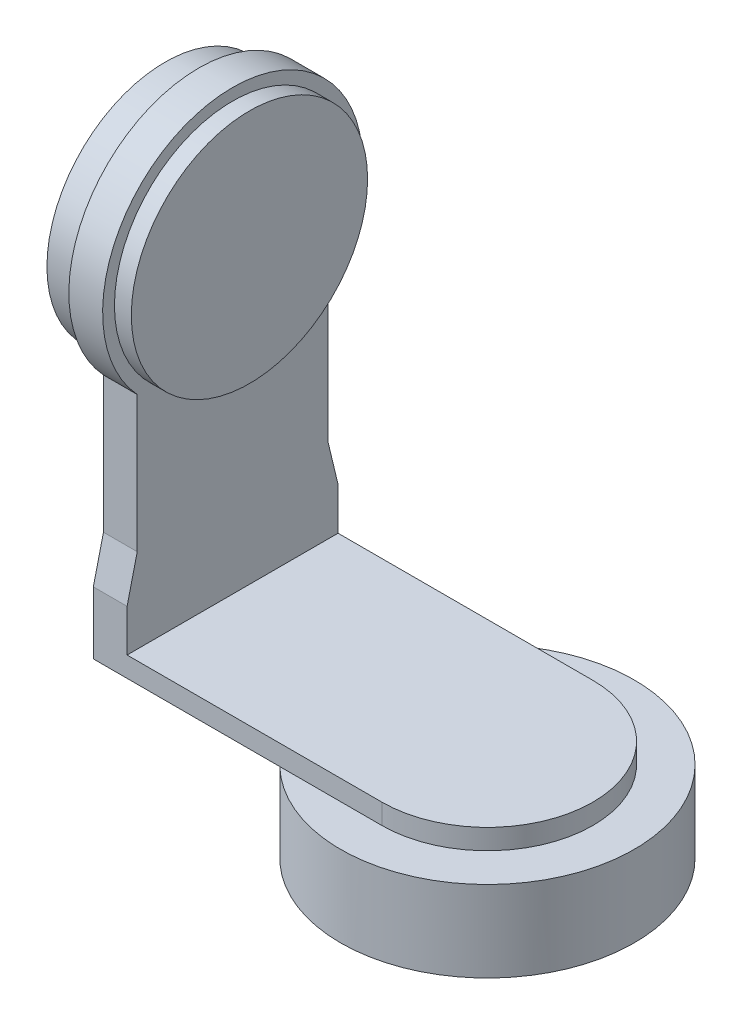
ISO-10303-21;
HEADER;
FILE_DESCRIPTION(('STEP AP214'),'2;1');
FILE_NAME('part.step','',(''),(''),'','','');
FILE_SCHEMA(('AUTOMOTIVE_DESIGN { 1 0 10303 214 1 1 1 1 }'));
ENDSEC;
DATA;
#1=APPLICATION_CONTEXT('core data for automotive mechanical design processes');
#2=APPLICATION_PROTOCOL_DEFINITION('international standard','automotive_design',2000,#1);
#3=PRODUCT_CONTEXT('',#1,'mechanical');
#4=PRODUCT('Part','Part','',(#3));
#5=PRODUCT_RELATED_PRODUCT_CATEGORY('part','',(#4));
#6=PRODUCT_DEFINITION_FORMATION('','',#4);
#7=PRODUCT_DEFINITION_CONTEXT('part definition',#1,'design');
#8=PRODUCT_DEFINITION('design','',#6,#7);
#9=PRODUCT_DEFINITION_SHAPE('','',#8);
#10=(LENGTH_UNIT() NAMED_UNIT(*) SI_UNIT(.MILLI.,.METRE.));
#11=(NAMED_UNIT(*) PLANE_ANGLE_UNIT() SI_UNIT($,.RADIAN.));
#12=(NAMED_UNIT(*) SI_UNIT($,.STERADIAN.) SOLID_ANGLE_UNIT());
#13=UNCERTAINTY_MEASURE_WITH_UNIT(LENGTH_MEASURE(1.E-05),#10,'distance_accuracy_value','');
#14=(GEOMETRIC_REPRESENTATION_CONTEXT(3) GLOBAL_UNCERTAINTY_ASSIGNED_CONTEXT((#13)) GLOBAL_UNIT_ASSIGNED_CONTEXT((#10,
#11,#12)) REPRESENTATION_CONTEXT('',''));
#15=CARTESIAN_POINT('',(0.,0.,0.));
#16=DIRECTION('',(0.,0.,1.));
#17=DIRECTION('',(1.,0.,0.));
#18=AXIS2_PLACEMENT_3D('',#15,#16,#17);
#19=CARTESIAN_POINT('',(0.,12.,0.));
#20=DIRECTION('',(0.,1.,0.));
#21=DIRECTION('',(0.,0.,1.));
#22=AXIS2_PLACEMENT_3D('',#19,#20,#21);
#23=PLANE('',#22);
#24=DIRECTION('',(-1.,0.,0.));
#25=VECTOR('',#24,1.);
#26=CARTESIAN_POINT('',(-34.2,12.,-12.5));
#27=LINE('',#26,#25);
#28=CARTESIAN_POINT('',(0.,12.,-12.5));
#29=VERTEX_POINT('',#28);
#30=CARTESIAN_POINT('',(-30.2,12.,-12.5));
#31=VERTEX_POINT('',#30);
#32=EDGE_CURVE('E185',#29,#31,#27,.T.);
#33=ORIENTED_EDGE('',*,*,#32,.T.);
#34=DIRECTION('',(0.,0.,1.));
#35=VECTOR('',#34,1.);
#36=CARTESIAN_POINT('',(-30.2,12.,12.5));
#37=LINE('',#36,#35);
#38=CARTESIAN_POINT('',(-30.2,12.,12.5));
#39=VERTEX_POINT('',#38);
#40=EDGE_CURVE('E156',#31,#39,#37,.T.);
#41=ORIENTED_EDGE('',*,*,#40,.T.);
#42=DIRECTION('',(1.,0.,0.));
#43=VECTOR('',#42,1.);
#44=CARTESIAN_POINT('',(0.,12.,12.5));
#45=LINE('',#44,#43);
#46=CARTESIAN_POINT('',(0.,12.,12.5));
#47=VERTEX_POINT('',#46);
#48=EDGE_CURVE('E189',#39,#47,#45,.T.);
#49=ORIENTED_EDGE('',*,*,#48,.T.);
#50=CARTESIAN_POINT('',(0.,12.,0.));
#51=DIRECTION('',(0.,1.,0.));
#52=DIRECTION('',(0.,0.,1.));
#53=AXIS2_PLACEMENT_3D('',#50,#51,#52);
#54=CIRCLE('',#53,12.5);
#55=EDGE_CURVE('E182',#47,#29,#54,.T.);
#56=ORIENTED_EDGE('',*,*,#55,.T.);
#57=EDGE_LOOP('',(#33,#41,#49,#56));
#58=FACE_BOUND('',#57,.T.);
#59=ADVANCED_FACE('F35',(#58),#23,.T.);
#60=CARTESIAN_POINT('',(0.,9.6,0.));
#61=DIRECTION('',(0.,-1.,0.));
#62=DIRECTION('',(0.,0.,-1.));
#63=AXIS2_PLACEMENT_3D('',#60,#61,#62);
#64=CYLINDRICAL_SURFACE('',#63,17.4);
#65=CARTESIAN_POINT('',(0.,9.6,0.));
#66=DIRECTION('',(0.,1.,0.));
#67=DIRECTION('',(0.,0.,1.));
#68=AXIS2_PLACEMENT_3D('',#65,#66,#67);
#69=CIRCLE('',#68,17.4);
#70=CARTESIAN_POINT('',(-12.1041315260534,9.6,-12.5));
#71=VERTEX_POINT('',#70);
#72=CARTESIAN_POINT('',(-12.1041315260534,9.6,12.5));
#73=VERTEX_POINT('',#72);
#74=EDGE_CURVE('E214',#71,#73,#69,.T.);
#75=ORIENTED_EDGE('',*,*,#74,.F.);
#76=EDGE_CURVE('E216',#73,#71,#69,.T.);
#77=ORIENTED_EDGE('',*,*,#76,.F.);
#78=EDGE_LOOP('',(#75,#77));
#79=FACE_BOUND('',#78,.T.);
#80=CARTESIAN_POINT('',(0.,0.,0.));
#81=DIRECTION('',(0.,1.,0.));
#82=DIRECTION('',(0.,0.,1.));
#83=AXIS2_PLACEMENT_3D('',#80,#81,#82);
#84=CIRCLE('',#83,17.4);
#85=CARTESIAN_POINT('',(0.,0.,17.4));
#86=VERTEX_POINT('',#85);
#87=EDGE_CURVE('E213',#86,#86,#84,.T.);
#88=ORIENTED_EDGE('',*,*,#87,.T.);
#89=EDGE_LOOP('',(#88));
#90=FACE_BOUND('',#89,.T.);
#91=ADVANCED_FACE('F37',(#79,#90),#64,.T.);
#92=CARTESIAN_POINT('',(0.,9.6,0.));
#93=DIRECTION('',(0.,1.,0.));
#94=DIRECTION('',(0.,0.,1.));
#95=AXIS2_PLACEMENT_3D('',#92,#93,#94);
#96=PLANE('',#95);
#97=DIRECTION('',(1.,0.,0.));
#98=VECTOR('',#97,1.);
#99=CARTESIAN_POINT('',(0.,9.6,12.5));
#100=LINE('',#99,#98);
#101=CARTESIAN_POINT('',(0.,9.6,12.5));
#102=VERTEX_POINT('',#101);
#103=EDGE_CURVE('E201',#73,#102,#100,.T.);
#104=ORIENTED_EDGE('',*,*,#103,.F.);
#105=ORIENTED_EDGE('',*,*,#76,.T.);
#106=DIRECTION('',(-1.,0.,0.));
#107=VECTOR('',#106,1.);
#108=CARTESIAN_POINT('',(-34.2,9.6,-12.5));
#109=LINE('',#108,#107);
#110=CARTESIAN_POINT('',(0.,9.6,-12.5));
#111=VERTEX_POINT('',#110);
#112=EDGE_CURVE('E194',#111,#71,#109,.T.);
#113=ORIENTED_EDGE('',*,*,#112,.F.);
#114=CARTESIAN_POINT('',(0.,9.6,0.));
#115=DIRECTION('',(0.,1.,0.));
#116=DIRECTION('',(0.,0.,1.));
#117=AXIS2_PLACEMENT_3D('',#114,#115,#116);
#118=CIRCLE('',#117,12.5);
#119=EDGE_CURVE('E58',#102,#111,#118,.T.);
#120=ORIENTED_EDGE('',*,*,#119,.F.);
#121=EDGE_LOOP('',(#104,#105,#113,#120));
#122=FACE_BOUND('',#121,.T.);
#123=ADVANCED_FACE('F223',(#122),#96,.T.);
#124=CARTESIAN_POINT('',(0.,0.,0.));
#125=DIRECTION('',(0.,1.,0.));
#126=DIRECTION('',(0.,0.,1.));
#127=AXIS2_PLACEMENT_3D('',#124,#125,#126);
#128=PLANE('',#127);
#129=ORIENTED_EDGE('',*,*,#87,.F.);
#130=EDGE_LOOP('',(#129));
#131=FACE_BOUND('',#130,.T.);
#132=ADVANCED_FACE('F268',(#131),#128,.F.);
#133=CARTESIAN_POINT('',(0.,9.6,0.));
#134=DIRECTION('',(0.,1.,0.));
#135=DIRECTION('',(0.,0.,1.));
#136=AXIS2_PLACEMENT_3D('',#133,#134,#135);
#137=PLANE('',#136);
#138=CARTESIAN_POINT('',(-34.2,9.6,-12.5));
#139=VERTEX_POINT('',#138);
#140=EDGE_CURVE('E193',#71,#139,#109,.T.);
#141=ORIENTED_EDGE('',*,*,#140,.F.);
#142=ORIENTED_EDGE('',*,*,#74,.T.);
#143=CARTESIAN_POINT('',(-34.2,9.6,12.5));
#144=VERTEX_POINT('',#143);
#145=EDGE_CURVE('E186',#144,#73,#100,.T.);
#146=ORIENTED_EDGE('',*,*,#145,.F.);
#147=DIRECTION('',(0.,0.,1.));
#148=VECTOR('',#147,1.);
#149=CARTESIAN_POINT('',(-34.2,9.6,12.5));
#150=LINE('',#149,#148);
#151=EDGE_CURVE('E197',#139,#144,#150,.T.);
#152=ORIENTED_EDGE('',*,*,#151,.F.);
#153=EDGE_LOOP('',(#141,#142,#146,#152));
#154=FACE_BOUND('',#153,.T.);
#155=ADVANCED_FACE('F227',(#154),#137,.F.);
#156=CARTESIAN_POINT('',(0.,12.,0.));
#157=DIRECTION('',(0.,-1.,0.));
#158=DIRECTION('',(0.,0.,-1.));
#159=AXIS2_PLACEMENT_3D('',#156,#157,#158);
#160=CYLINDRICAL_SURFACE('',#159,12.5);
#161=ORIENTED_EDGE('',*,*,#119,.T.);
#162=DIRECTION('',(0.,-1.,0.));
#163=VECTOR('',#162,1.);
#164=CARTESIAN_POINT('',(0.,12.,-12.5));
#165=LINE('',#164,#163);
#166=EDGE_CURVE('E210',#29,#111,#165,.T.);
#167=ORIENTED_EDGE('',*,*,#166,.F.);
#168=ORIENTED_EDGE('',*,*,#55,.F.);
#169=DIRECTION('',(0.,-1.,0.));
#170=VECTOR('',#169,1.);
#171=CARTESIAN_POINT('',(0.,12.,12.5));
#172=LINE('',#171,#170);
#173=EDGE_CURVE('E191',#47,#102,#172,.T.);
#174=ORIENTED_EDGE('',*,*,#173,.T.);
#175=EDGE_LOOP('',(#161,#167,#168,#174));
#176=FACE_BOUND('',#175,.T.);
#177=ADVANCED_FACE('F234',(#176),#160,.T.);
#178=CARTESIAN_POINT('',(-34.2,12.,-12.5));
#179=DIRECTION('',(0.,0.,1.));
#180=DIRECTION('',(1.,0.,0.));
#181=AXIS2_PLACEMENT_3D('',#178,#179,#180);
#182=PLANE('',#181);
#183=ORIENTED_EDGE('',*,*,#112,.T.);
#184=ORIENTED_EDGE('',*,*,#140,.T.);
#185=DIRECTION('',(0.,-1.,0.));
#186=VECTOR('',#185,1.);
#187=CARTESIAN_POINT('',(-34.2,12.,-12.5));
#188=LINE('',#187,#186);
#189=CARTESIAN_POINT('',(-34.2,17.,-12.5));
#190=VERTEX_POINT('',#189);
#191=EDGE_CURVE('E207',#190,#139,#188,.T.);
#192=ORIENTED_EDGE('',*,*,#191,.F.);
#193=DIRECTION('',(-1.,0.,0.));
#194=VECTOR('',#193,1.);
#195=CARTESIAN_POINT('',(-30.2,17.,-12.5));
#196=LINE('',#195,#194);
#197=CARTESIAN_POINT('',(-30.2,17.,-12.5));
#198=VERTEX_POINT('',#197);
#199=EDGE_CURVE('E178',#198,#190,#196,.T.);
#200=ORIENTED_EDGE('',*,*,#199,.F.);
#201=DIRECTION('',(0.,-1.,0.));
#202=VECTOR('',#201,1.);
#203=CARTESIAN_POINT('',(-30.2,12.,-12.5));
#204=LINE('',#203,#202);
#205=EDGE_CURVE('E153',#198,#31,#204,.T.);
#206=ORIENTED_EDGE('',*,*,#205,.T.);
#207=ORIENTED_EDGE('',*,*,#32,.F.);
#208=ORIENTED_EDGE('',*,*,#166,.T.);
#209=EDGE_LOOP('',(#183,#184,#192,#200,#206,#207,#208));
#210=FACE_BOUND('',#209,.T.);
#211=ADVANCED_FACE('F230',(#210),#182,.F.);
#212=CARTESIAN_POINT('',(-34.2,12.,12.5));
#213=DIRECTION('',(1.,0.,0.));
#214=DIRECTION('',(0.,0.,-1.));
#215=AXIS2_PLACEMENT_3D('',#212,#213,#214);
#216=PLANE('',#215);
#217=CARTESIAN_POINT('',(-34.2,48.6,0.));
#218=DIRECTION('',(-1.,0.,0.));
#219=DIRECTION('',(0.,0.,1.));
#220=AXIS2_PLACEMENT_3D('',#217,#218,#219);
#221=CIRCLE('',#220,14.);
#222=CARTESIAN_POINT('',(-34.2,48.6,14.));
#223=VERTEX_POINT('',#222);
#224=EDGE_CURVE('E43',#223,#223,#221,.T.);
#225=ORIENTED_EDGE('',*,*,#224,.F.);
#226=EDGE_LOOP('',(#225));
#227=FACE_BOUND('',#226,.T.);
#228=ORIENTED_EDGE('',*,*,#151,.T.);
#229=DIRECTION('',(0.,-1.,0.));
#230=VECTOR('',#229,1.);
#231=CARTESIAN_POINT('',(-34.2,12.,12.5));
#232=LINE('',#231,#230);
#233=CARTESIAN_POINT('',(-34.2,17.,12.5));
#234=VERTEX_POINT('',#233);
#235=EDGE_CURVE('E204',#234,#144,#232,.T.);
#236=ORIENTED_EDGE('',*,*,#235,.F.);
#237=DIRECTION('',(0.,0.972387301980517,-0.233372952475324));
#238=VECTOR('',#237,1.);
#239=CARTESIAN_POINT('',(-34.2,17.,12.5));
#240=LINE('',#239,#238);
#241=CARTESIAN_POINT('',(-34.2,22.,11.3));
#242=VERTEX_POINT('',#241);
#243=EDGE_CURVE('E147',#234,#242,#240,.T.);
#244=ORIENTED_EDGE('',*,*,#243,.T.);
#245=DIRECTION('',(0.,1.,0.));
#246=VECTOR('',#245,1.);
#247=CARTESIAN_POINT('',(-34.2,22.,11.3));
#248=LINE('',#247,#246);
#249=CARTESIAN_POINT('',(-34.2,38.1372087854149,11.3));
#250=VERTEX_POINT('',#249);
#251=EDGE_CURVE('E144',#242,#250,#248,.T.);
#252=ORIENTED_EDGE('',*,*,#251,.T.);
#253=CARTESIAN_POINT('',(-34.2,48.6,0.));
#254=DIRECTION('',(-1.,0.,0.));
#255=DIRECTION('',(0.,0.,1.));
#256=AXIS2_PLACEMENT_3D('',#253,#254,#255);
#257=CIRCLE('',#256,15.4);
#258=CARTESIAN_POINT('',(-34.2,38.1372087854149,-11.3));
#259=VERTEX_POINT('',#258);
#260=EDGE_CURVE('E163',#250,#259,#257,.T.);
#261=ORIENTED_EDGE('',*,*,#260,.T.);
#262=DIRECTION('',(0.,-1.,0.));
#263=VECTOR('',#262,1.);
#264=CARTESIAN_POINT('',(-34.2,22.,-11.3));
#265=LINE('',#264,#263);
#266=CARTESIAN_POINT('',(-34.2,22.,-11.3));
#267=VERTEX_POINT('',#266);
#268=EDGE_CURVE('E124',#259,#267,#265,.T.);
#269=ORIENTED_EDGE('',*,*,#268,.T.);
#270=DIRECTION('',(0.,-0.972387301980517,-0.233372952475324));
#271=VECTOR('',#270,1.);
#272=CARTESIAN_POINT('',(-34.2,17.,-12.5));
#273=LINE('',#272,#271);
#274=EDGE_CURVE('E167',#267,#190,#273,.T.);
#275=ORIENTED_EDGE('',*,*,#274,.T.);
#276=ORIENTED_EDGE('',*,*,#191,.T.);
#277=EDGE_LOOP('',(#228,#236,#244,#252,#261,#269,#275,#276));
#278=FACE_BOUND('',#277,.T.);
#279=ADVANCED_FACE('F244',(#227,#278),#216,.F.);
#280=CARTESIAN_POINT('',(0.,12.,12.5));
#281=DIRECTION('',(0.,0.,-1.));
#282=DIRECTION('',(-1.,0.,0.));
#283=AXIS2_PLACEMENT_3D('',#280,#281,#282);
#284=PLANE('',#283);
#285=ORIENTED_EDGE('',*,*,#145,.T.);
#286=ORIENTED_EDGE('',*,*,#103,.T.);
#287=ORIENTED_EDGE('',*,*,#173,.F.);
#288=ORIENTED_EDGE('',*,*,#48,.F.);
#289=DIRECTION('',(0.,1.,0.));
#290=VECTOR('',#289,1.);
#291=CARTESIAN_POINT('',(-30.2,12.,12.5));
#292=LINE('',#291,#290);
#293=CARTESIAN_POINT('',(-30.2,17.,12.5));
#294=VERTEX_POINT('',#293);
#295=EDGE_CURVE('E50',#39,#294,#292,.T.);
#296=ORIENTED_EDGE('',*,*,#295,.T.);
#297=DIRECTION('',(-1.,0.,0.));
#298=VECTOR('',#297,1.);
#299=CARTESIAN_POINT('',(-30.2,17.,12.5));
#300=LINE('',#299,#298);
#301=EDGE_CURVE('E175',#294,#234,#300,.T.);
#302=ORIENTED_EDGE('',*,*,#301,.T.);
#303=ORIENTED_EDGE('',*,*,#235,.T.);
#304=EDGE_LOOP('',(#285,#286,#287,#288,#296,#302,#303));
#305=FACE_BOUND('',#304,.T.);
#306=ADVANCED_FACE('F238',(#305),#284,.F.);
#307=CARTESIAN_POINT('',(-30.2,48.6,0.));
#308=DIRECTION('',(-1.,0.,0.));
#309=DIRECTION('',(0.,0.,1.));
#310=AXIS2_PLACEMENT_3D('',#307,#308,#309);
#311=CYLINDRICAL_SURFACE('',#310,15.4);
#312=ORIENTED_EDGE('',*,*,#260,.F.);
#313=DIRECTION('',(-1.,0.,0.));
#314=VECTOR('',#313,1.);
#315=CARTESIAN_POINT('',(-30.2,38.1372087854149,11.3));
#316=LINE('',#315,#314);
#317=CARTESIAN_POINT('',(-30.2,38.1372087854149,11.3));
#318=VERTEX_POINT('',#317);
#319=EDGE_CURVE('E143',#318,#250,#316,.T.);
#320=ORIENTED_EDGE('',*,*,#319,.F.);
#321=CARTESIAN_POINT('',(-30.2,48.6,0.));
#322=DIRECTION('',(-1.,0.,0.));
#323=DIRECTION('',(0.,0.,1.));
#324=AXIS2_PLACEMENT_3D('',#321,#322,#323);
#325=CIRCLE('',#324,15.4);
#326=CARTESIAN_POINT('',(-30.2,38.1372087854149,-11.3));
#327=VERTEX_POINT('',#326);
#328=EDGE_CURVE('E136',#318,#327,#325,.T.);
#329=ORIENTED_EDGE('',*,*,#328,.T.);
#330=DIRECTION('',(-1.,0.,0.));
#331=VECTOR('',#330,1.);
#332=CARTESIAN_POINT('',(-30.2,38.1372087854149,-11.3));
#333=LINE('',#332,#331);
#334=EDGE_CURVE('E119',#327,#259,#333,.T.);
#335=ORIENTED_EDGE('',*,*,#334,.T.);
#336=EDGE_LOOP('',(#312,#320,#329,#335));
#337=FACE_BOUND('',#336,.T.);
#338=ADVANCED_FACE('F142',(#337),#311,.T.);
#339=CARTESIAN_POINT('',(-30.2,22.,11.3));
#340=DIRECTION('',(0.,0.,1.));
#341=DIRECTION('',(1.,0.,0.));
#342=AXIS2_PLACEMENT_3D('',#339,#340,#341);
#343=PLANE('',#342);
#344=ORIENTED_EDGE('',*,*,#251,.F.);
#345=DIRECTION('',(-1.,0.,0.));
#346=VECTOR('',#345,1.);
#347=CARTESIAN_POINT('',(-30.2,22.,11.3));
#348=LINE('',#347,#346);
#349=CARTESIAN_POINT('',(-30.2,22.,11.3));
#350=VERTEX_POINT('',#349);
#351=EDGE_CURVE('E173',#350,#242,#348,.T.);
#352=ORIENTED_EDGE('',*,*,#351,.F.);
#353=DIRECTION('',(0.,1.,0.));
#354=VECTOR('',#353,1.);
#355=CARTESIAN_POINT('',(-30.2,22.,11.3));
#356=LINE('',#355,#354);
#357=EDGE_CURVE('E130',#350,#318,#356,.T.);
#358=ORIENTED_EDGE('',*,*,#357,.T.);
#359=ORIENTED_EDGE('',*,*,#319,.T.);
#360=EDGE_LOOP('',(#344,#352,#358,#359));
#361=FACE_BOUND('',#360,.T.);
#362=ADVANCED_FACE('F253',(#361),#343,.T.);
#363=CARTESIAN_POINT('',(-30.2,17.,12.5));
#364=DIRECTION('',(0.,0.233372952475324,0.972387301980517));
#365=DIRECTION('',(0.,-0.972387301980517,0.233372952475324));
#366=AXIS2_PLACEMENT_3D('',#363,#364,#365);
#367=PLANE('',#366);
#368=ORIENTED_EDGE('',*,*,#243,.F.);
#369=ORIENTED_EDGE('',*,*,#301,.F.);
#370=DIRECTION('',(0.,0.972387301980517,-0.233372952475324));
#371=VECTOR('',#370,1.);
#372=CARTESIAN_POINT('',(-30.2,17.,12.5));
#373=LINE('',#372,#371);
#374=EDGE_CURVE('E159',#294,#350,#373,.T.);
#375=ORIENTED_EDGE('',*,*,#374,.T.);
#376=ORIENTED_EDGE('',*,*,#351,.T.);
#377=EDGE_LOOP('',(#368,#369,#375,#376));
#378=FACE_BOUND('',#377,.T.);
#379=ADVANCED_FACE('F250',(#378),#367,.T.);
#380=CARTESIAN_POINT('',(-30.2,17.,-12.5));
#381=DIRECTION('',(0.,0.233372952475324,-0.972387301980517));
#382=DIRECTION('',(0.,0.972387301980517,0.233372952475324));
#383=AXIS2_PLACEMENT_3D('',#380,#381,#382);
#384=PLANE('',#383);
#385=ORIENTED_EDGE('',*,*,#274,.F.);
#386=DIRECTION('',(-1.,0.,0.));
#387=VECTOR('',#386,1.);
#388=CARTESIAN_POINT('',(-30.2,22.,-11.3));
#389=LINE('',#388,#387);
#390=CARTESIAN_POINT('',(-30.2,22.,-11.3));
#391=VERTEX_POINT('',#390);
#392=EDGE_CURVE('E129',#391,#267,#389,.T.);
#393=ORIENTED_EDGE('',*,*,#392,.F.);
#394=DIRECTION('',(0.,-0.972387301980517,-0.233372952475324));
#395=VECTOR('',#394,1.);
#396=CARTESIAN_POINT('',(-30.2,17.,-12.5));
#397=LINE('',#396,#395);
#398=EDGE_CURVE('E140',#391,#198,#397,.T.);
#399=ORIENTED_EDGE('',*,*,#398,.T.);
#400=ORIENTED_EDGE('',*,*,#199,.T.);
#401=EDGE_LOOP('',(#385,#393,#399,#400));
#402=FACE_BOUND('',#401,.T.);
#403=ADVANCED_FACE('F256',(#402),#384,.T.);
#404=CARTESIAN_POINT('',(-30.2,22.,-11.3));
#405=DIRECTION('',(0.,0.,-1.));
#406=DIRECTION('',(-1.,0.,0.));
#407=AXIS2_PLACEMENT_3D('',#404,#405,#406);
#408=PLANE('',#407);
#409=ORIENTED_EDGE('',*,*,#268,.F.);
#410=ORIENTED_EDGE('',*,*,#334,.F.);
#411=DIRECTION('',(0.,-1.,0.));
#412=VECTOR('',#411,1.);
#413=CARTESIAN_POINT('',(-30.2,22.,-11.3));
#414=LINE('',#413,#412);
#415=EDGE_CURVE('E122',#327,#391,#414,.T.);
#416=ORIENTED_EDGE('',*,*,#415,.T.);
#417=ORIENTED_EDGE('',*,*,#392,.T.);
#418=EDGE_LOOP('',(#409,#410,#416,#417));
#419=FACE_BOUND('',#418,.T.);
#420=ADVANCED_FACE('F121',(#419),#408,.T.);
#421=CARTESIAN_POINT('',(-30.2,48.6,0.));
#422=DIRECTION('',(-1.,0.,0.));
#423=DIRECTION('',(0.,0.,1.));
#424=AXIS2_PLACEMENT_3D('',#421,#422,#423);
#425=PLANE('',#424);
#426=CARTESIAN_POINT('',(-30.2,48.6,0.));
#427=DIRECTION('',(-1.,0.,0.));
#428=DIRECTION('',(0.,0.,1.));
#429=AXIS2_PLACEMENT_3D('',#426,#427,#428);
#430=CIRCLE('',#429,14.);
#431=CARTESIAN_POINT('',(-30.2,48.6,14.));
#432=VERTEX_POINT('',#431);
#433=EDGE_CURVE('E11',#432,#432,#430,.F.);
#434=ORIENTED_EDGE('',*,*,#433,.F.);
#435=EDGE_LOOP('',(#434));
#436=FACE_BOUND('',#435,.T.);
#437=ORIENTED_EDGE('',*,*,#328,.F.);
#438=ORIENTED_EDGE('',*,*,#357,.F.);
#439=ORIENTED_EDGE('',*,*,#374,.F.);
#440=ORIENTED_EDGE('',*,*,#295,.F.);
#441=ORIENTED_EDGE('',*,*,#40,.F.);
#442=ORIENTED_EDGE('',*,*,#205,.F.);
#443=ORIENTED_EDGE('',*,*,#398,.F.);
#444=ORIENTED_EDGE('',*,*,#415,.F.);
#445=EDGE_LOOP('',(#437,#438,#439,#440,#441,#442,#443,#444));
#446=FACE_BOUND('',#445,.T.);
#447=ADVANCED_FACE('F134',(#436,#446),#425,.F.);
#448=CARTESIAN_POINT('',(-38.2,48.6,0.));
#449=DIRECTION('',(1.,0.,0.));
#450=DIRECTION('',(0.,0.,-1.));
#451=AXIS2_PLACEMENT_3D('',#448,#449,#450);
#452=CYLINDRICAL_SURFACE('',#451,14.);
#453=CARTESIAN_POINT('',(-38.2,48.6,0.));
#454=DIRECTION('',(-1.,0.,0.));
#455=DIRECTION('',(0.,0.,1.));
#456=AXIS2_PLACEMENT_3D('',#453,#454,#455);
#457=CIRCLE('',#456,14.);
#458=CARTESIAN_POINT('',(-38.2,48.6,14.));
#459=VERTEX_POINT('',#458);
#460=EDGE_CURVE('E165',#459,#459,#457,.T.);
#461=ORIENTED_EDGE('',*,*,#460,.F.);
#462=EDGE_LOOP('',(#461));
#463=FACE_BOUND('',#462,.T.);
#464=ORIENTED_EDGE('',*,*,#224,.T.);
#465=EDGE_LOOP('',(#464));
#466=FACE_BOUND('',#465,.T.);
#467=ADVANCED_FACE('F242',(#463,#466),#452,.T.);
#468=CARTESIAN_POINT('',(-38.2,48.6,0.));
#469=DIRECTION('',(-1.,0.,0.));
#470=DIRECTION('',(0.,0.,1.));
#471=AXIS2_PLACEMENT_3D('',#468,#469,#470);
#472=PLANE('',#471);
#473=ORIENTED_EDGE('',*,*,#460,.T.);
#474=EDGE_LOOP('',(#473));
#475=FACE_BOUND('',#474,.T.);
#476=ADVANCED_FACE('F346',(#475),#472,.T.);
#477=CARTESIAN_POINT('',(-28.2,48.6,0.));
#478=DIRECTION('',(-1.,0.,0.));
#479=DIRECTION('',(0.,0.,1.));
#480=AXIS2_PLACEMENT_3D('',#477,#478,#479);
#481=CYLINDRICAL_SURFACE('',#480,14.);
#482=CARTESIAN_POINT('',(-28.2,48.6,0.));
#483=DIRECTION('',(1.,0.,0.));
#484=DIRECTION('',(0.,0.,-1.));
#485=AXIS2_PLACEMENT_3D('',#482,#483,#484);
#486=CIRCLE('',#485,14.);
#487=CARTESIAN_POINT('',(-28.2,48.6,-14.));
#488=VERTEX_POINT('',#487);
#489=EDGE_CURVE('E427',#488,#488,#486,.T.);
#490=ORIENTED_EDGE('',*,*,#489,.F.);
#491=EDGE_LOOP('',(#490));
#492=FACE_BOUND('',#491,.T.);
#493=ORIENTED_EDGE('',*,*,#433,.T.);
#494=EDGE_LOOP('',(#493));
#495=FACE_BOUND('',#494,.T.);
#496=ADVANCED_FACE('F353',(#492,#495),#481,.T.);
#497=CARTESIAN_POINT('',(-28.2,48.6,0.));
#498=DIRECTION('',(1.,0.,0.));
#499=DIRECTION('',(0.,0.,-1.));
#500=AXIS2_PLACEMENT_3D('',#497,#498,#499);
#501=PLANE('',#500);
#502=ORIENTED_EDGE('',*,*,#489,.T.);
#503=EDGE_LOOP('',(#502));
#504=FACE_BOUND('',#503,.T.);
#505=ADVANCED_FACE('F360',(#504),#501,.T.);
#506=CLOSED_SHELL('',(#59,#91,#123,#132,#155,#177,#211,#279,#306,#338,#362,#379,#403,#420,#447,
#467,#476,#496,#505));
#507=MANIFOLD_SOLID_BREP('B2',#506);
#508=ADVANCED_BREP_SHAPE_REPRESENTATION('',(#18,#507),#14);
#509=SHAPE_DEFINITION_REPRESENTATION(#9,#508);
ENDSEC;
END-ISO-10303-21;
